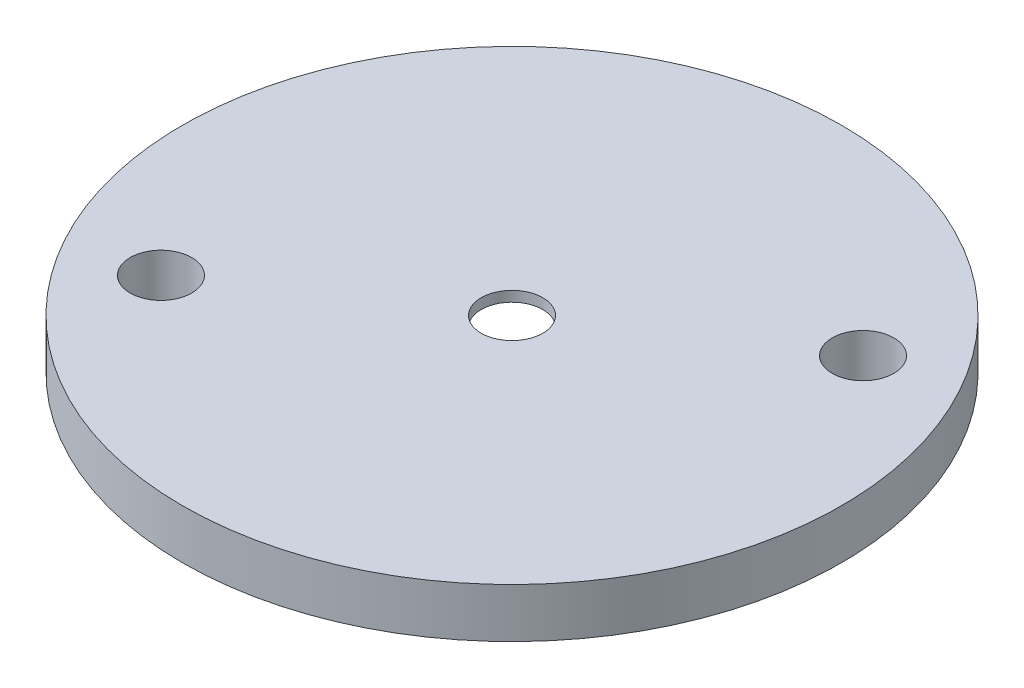
ISO-10303-21;
HEADER;
FILE_DESCRIPTION(('STEP AP214'),'2;1');
FILE_NAME('part.step','',(''),(''),'','','');
FILE_SCHEMA(('AUTOMOTIVE_DESIGN { 1 0 10303 214 1 1 1 1 }'));
ENDSEC;
DATA;
#1=APPLICATION_CONTEXT('core data for automotive mechanical design processes');
#2=APPLICATION_PROTOCOL_DEFINITION('international standard','automotive_design',2000,#1);
#3=PRODUCT_CONTEXT('',#1,'mechanical');
#4=PRODUCT('Part','Part','',(#3));
#5=PRODUCT_RELATED_PRODUCT_CATEGORY('part','',(#4));
#6=PRODUCT_DEFINITION_FORMATION('','',#4);
#7=PRODUCT_DEFINITION_CONTEXT('part definition',#1,'design');
#8=PRODUCT_DEFINITION('design','',#6,#7);
#9=PRODUCT_DEFINITION_SHAPE('','',#8);
#10=(LENGTH_UNIT() NAMED_UNIT(*) SI_UNIT(.MILLI.,.METRE.));
#11=(NAMED_UNIT(*) PLANE_ANGLE_UNIT() SI_UNIT($,.RADIAN.));
#12=(NAMED_UNIT(*) SI_UNIT($,.STERADIAN.) SOLID_ANGLE_UNIT());
#13=UNCERTAINTY_MEASURE_WITH_UNIT(LENGTH_MEASURE(1.E-05),#10,'distance_accuracy_value','');
#14=(GEOMETRIC_REPRESENTATION_CONTEXT(3) GLOBAL_UNCERTAINTY_ASSIGNED_CONTEXT((#13)) GLOBAL_UNIT_ASSIGNED_CONTEXT((#10,
#11,#12)) REPRESENTATION_CONTEXT('',''));
#15=CARTESIAN_POINT('',(0.,0.,0.));
#16=DIRECTION('',(0.,0.,1.));
#17=DIRECTION('',(1.,0.,0.));
#18=AXIS2_PLACEMENT_3D('',#15,#16,#17);
#19=CARTESIAN_POINT('',(0.,3.048,0.));
#20=DIRECTION('',(0.,-1.,0.));
#21=DIRECTION('',(0.,0.,-1.));
#22=AXIS2_PLACEMENT_3D('',#19,#20,#21);
#23=CYLINDRICAL_SURFACE('',#22,20.32);
#24=CARTESIAN_POINT('',(0.,3.048,0.));
#25=DIRECTION('',(0.,1.,0.));
#26=DIRECTION('',(0.,0.,1.));
#27=AXIS2_PLACEMENT_3D('',#24,#25,#26);
#28=CIRCLE('',#27,20.32);
#29=CARTESIAN_POINT('',(0.,3.048,-20.32));
#30=VERTEX_POINT('',#29);
#31=EDGE_CURVE('E12',#30,#30,#28,.T.);
#32=CARTESIAN_POINT('',(0.,0.,0.));
#33=DIRECTION('',(0.,1.,0.));
#34=DIRECTION('',(0.,0.,1.));
#35=AXIS2_PLACEMENT_3D('',#32,#33,#34);
#36=CIRCLE('',#35,20.32);
#37=CARTESIAN_POINT('',(0.,0.,-20.32));
#38=VERTEX_POINT('',#37);
#39=EDGE_CURVE('E44',#38,#38,#36,.T.);
#40=CARTESIAN_POINT('',(0.,3.048,-20.32));
#41=CARTESIAN_POINT('',(0.,3.01625,-20.32));
#42=CARTESIAN_POINT('',(0.,2.9845,-20.32));
#43=CARTESIAN_POINT('',(0.,2.921,-20.32));
#44=CARTESIAN_POINT('',(0.,2.88925,-20.32));
#45=CARTESIAN_POINT('',(0.,2.82575,-20.32));
#46=CARTESIAN_POINT('',(0.,2.794,-20.32));
#47=CARTESIAN_POINT('',(0.,2.7305,-20.32));
#48=CARTESIAN_POINT('',(0.,2.69875,-20.32));
#49=CARTESIAN_POINT('',(0.,2.63525,-20.32));
#50=CARTESIAN_POINT('',(0.,2.6035,-20.32));
#51=CARTESIAN_POINT('',(0.,2.54,-20.32));
#52=CARTESIAN_POINT('',(0.,2.50825,-20.32));
#53=CARTESIAN_POINT('',(0.,2.44475,-20.32));
#54=CARTESIAN_POINT('',(0.,2.413,-20.32));
#55=CARTESIAN_POINT('',(0.,2.3495,-20.32));
#56=CARTESIAN_POINT('',(0.,2.31775,-20.32));
#57=CARTESIAN_POINT('',(0.,2.25425,-20.32));
#58=CARTESIAN_POINT('',(0.,2.2225,-20.32));
#59=CARTESIAN_POINT('',(0.,2.159,-20.32));
#60=CARTESIAN_POINT('',(0.,2.12725,-20.32));
#61=CARTESIAN_POINT('',(0.,2.06375,-20.32));
#62=CARTESIAN_POINT('',(0.,2.032,-20.32));
#63=CARTESIAN_POINT('',(0.,1.9685,-20.32));
#64=CARTESIAN_POINT('',(0.,1.93675,-20.32));
#65=CARTESIAN_POINT('',(0.,1.87325,-20.32));
#66=CARTESIAN_POINT('',(0.,1.8415,-20.32));
#67=CARTESIAN_POINT('',(0.,1.778,-20.32));
#68=CARTESIAN_POINT('',(0.,1.74625,-20.32));
#69=CARTESIAN_POINT('',(0.,1.68275,-20.32));
#70=CARTESIAN_POINT('',(0.,1.651,-20.32));
#71=CARTESIAN_POINT('',(0.,1.5875,-20.32));
#72=CARTESIAN_POINT('',(0.,1.55575,-20.32));
#73=CARTESIAN_POINT('',(0.,1.49225,-20.32));
#74=CARTESIAN_POINT('',(0.,1.4605,-20.32));
#75=CARTESIAN_POINT('',(0.,1.397,-20.32));
#76=CARTESIAN_POINT('',(0.,1.36525,-20.32));
#77=CARTESIAN_POINT('',(0.,1.30175,-20.32));
#78=CARTESIAN_POINT('',(0.,1.27,-20.32));
#79=CARTESIAN_POINT('',(0.,1.2065,-20.32));
#80=CARTESIAN_POINT('',(0.,1.17475,-20.32));
#81=CARTESIAN_POINT('',(0.,1.11125,-20.32));
#82=CARTESIAN_POINT('',(0.,1.0795,-20.32));
#83=CARTESIAN_POINT('',(0.,1.016,-20.32));
#84=CARTESIAN_POINT('',(0.,0.98425,-20.32));
#85=CARTESIAN_POINT('',(0.,0.92075,-20.32));
#86=CARTESIAN_POINT('',(0.,0.889,-20.32));
#87=CARTESIAN_POINT('',(0.,0.8255,-20.32));
#88=CARTESIAN_POINT('',(0.,0.79375,-20.32));
#89=CARTESIAN_POINT('',(0.,0.73025,-20.32));
#90=CARTESIAN_POINT('',(0.,0.6985,-20.32));
#91=CARTESIAN_POINT('',(0.,0.635,-20.32));
#92=CARTESIAN_POINT('',(0.,0.60325,-20.32));
#93=CARTESIAN_POINT('',(0.,0.53975,-20.32));
#94=CARTESIAN_POINT('',(0.,0.508,-20.32));
#95=CARTESIAN_POINT('',(0.,0.4445,-20.32));
#96=CARTESIAN_POINT('',(0.,0.41275,-20.32));
#97=CARTESIAN_POINT('',(0.,0.34925,-20.32));
#98=CARTESIAN_POINT('',(0.,0.3175,-20.32));
#99=CARTESIAN_POINT('',(0.,0.254,-20.32));
#100=CARTESIAN_POINT('',(0.,0.22225,-20.32));
#101=CARTESIAN_POINT('',(0.,0.15875,-20.32));
#102=CARTESIAN_POINT('',(0.,0.127,-20.32));
#103=CARTESIAN_POINT('',(0.,0.0634999999999999,-20.32));
#104=CARTESIAN_POINT('',(0.,0.03175,-20.32));
#105=CARTESIAN_POINT('',(0.,0.,-20.32));
#106=B_SPLINE_CURVE_WITH_KNOTS('',3,(#40,#41,#42,#43,#44,#45,#46,#47,#48,#49,#50,#51,#52,#53,
#54,#55,#56,#57,#58,#59,#60,#61,#62,#63,#64,#65,#66,#67,#68,#69,#70,#71,#72,#73,#74,#75,#76,#77,
#78,#79,#80,#81,#82,#83,#84,#85,#86,#87,#88,#89,#90,#91,#92,#93,#94,#95,#96,#97,#98,#99,#100,
#101,#102,#103,#104,#105),.UNSPECIFIED.,.F.,.F.,(4,2,2,2,2,2,2,2,2,2,2,2,2,2,2,2,2,2,2,2,2,2,2,
2,2,2,2,2,2,2,2,2,4),(0.,0.0952499999999998,0.1905,0.28575,0.381,0.47625,0.5715,0.66675,0.762,
0.85725,0.9525,1.04775,1.143,1.23825,1.3335,1.42875,1.524,1.61925,1.7145,1.80975,1.905,2.00025,
2.0955,2.19075,2.286,2.38125,2.4765,2.57175,2.667,2.76225,2.8575,2.95275,3.048),.UNSPECIFIED.);
#107=EDGE_CURVE('BSEAM34',#30,#38,#106,.T.);
#108=ORIENTED_EDGE('',*,*,#31,.F.);
#109=ORIENTED_EDGE('',*,*,#39,.T.);
#110=ORIENTED_EDGE('',*,*,#107,.T.);
#111=ORIENTED_EDGE('',*,*,#107,.F.);
#112=EDGE_LOOP('',(#108,#110,#109,#111));
#113=FACE_BOUND('',#112,.T.);
#114=ADVANCED_FACE('F34',(#113),#23,.T.);
#115=CARTESIAN_POINT('',(0.,3.048,0.));
#116=DIRECTION('',(0.,1.,0.));
#117=DIRECTION('',(0.,0.,1.));
#118=AXIS2_PLACEMENT_3D('',#115,#116,#117);
#119=PLANE('',#118);
#120=CARTESIAN_POINT('',(12.9669844794509,3.048,-8.67821779565681));
#121=DIRECTION('',(0.,-1.,0.));
#122=DIRECTION('',(0.,0.,-1.));
#123=AXIS2_PLACEMENT_3D('',#120,#121,#122);
#124=CIRCLE('',#123,1.89864999999999);
#125=CARTESIAN_POINT('',(12.9669844794509,3.048,-10.5768677956568));
#126=VERTEX_POINT('',#125);
#127=EDGE_CURVE('E441',#126,#126,#124,.T.);
#128=ORIENTED_EDGE('',*,*,#127,.T.);
#129=EDGE_LOOP('',(#128));
#130=FACE_BOUND('',#129,.T.);
#131=CARTESIAN_POINT('',(-12.9669844794509,3.048,8.67821779565681));
#132=DIRECTION('',(0.,-1.,0.));
#133=DIRECTION('',(0.,0.,-1.));
#134=AXIS2_PLACEMENT_3D('',#131,#132,#133);
#135=CIRCLE('',#134,1.89864999999999);
#136=CARTESIAN_POINT('',(-12.9669844794509,3.048,6.77956779565682));
#137=VERTEX_POINT('',#136);
#138=EDGE_CURVE('E440',#137,#137,#135,.T.);
#139=ORIENTED_EDGE('',*,*,#138,.T.);
#140=EDGE_LOOP('',(#139));
#141=FACE_BOUND('',#140,.T.);
#142=CARTESIAN_POINT('',(0.,3.048,0.));
#143=DIRECTION('',(0.,1.,0.));
#144=DIRECTION('',(0.,0.,1.));
#145=AXIS2_PLACEMENT_3D('',#142,#143,#144);
#146=CIRCLE('',#145,1.89864999999999);
#147=CARTESIAN_POINT('',(0.,3.048,1.89864999999999));
#148=VERTEX_POINT('',#147);
#149=EDGE_CURVE('E444',#148,#148,#146,.T.);
#150=ORIENTED_EDGE('',*,*,#149,.F.);
#151=EDGE_LOOP('',(#150));
#152=FACE_BOUND('',#151,.T.);
#153=ORIENTED_EDGE('',*,*,#31,.T.);
#154=EDGE_LOOP('',(#153));
#155=FACE_BOUND('',#154,.T.);
#156=ADVANCED_FACE('F269',(#130,#141,#152,#155),#119,.T.);
#157=CARTESIAN_POINT('',(0.,0.,0.));
#158=DIRECTION('',(0.,1.,0.));
#159=DIRECTION('',(0.,0.,1.));
#160=AXIS2_PLACEMENT_3D('',#157,#158,#159);
#161=PLANE('',#160);
#162=CARTESIAN_POINT('',(12.9669844794509,0.,-8.67821779565681));
#163=DIRECTION('',(0.,-1.,0.));
#164=DIRECTION('',(0.,0.,-1.));
#165=AXIS2_PLACEMENT_3D('',#162,#163,#164);
#166=CIRCLE('',#165,1.89864999999999);
#167=CARTESIAN_POINT('',(12.9669844794509,0.,-10.5768677956568));
#168=VERTEX_POINT('',#167);
#169=EDGE_CURVE('E435',#168,#168,#166,.T.);
#170=ORIENTED_EDGE('',*,*,#169,.F.);
#171=EDGE_LOOP('',(#170));
#172=FACE_BOUND('',#171,.T.);
#173=CARTESIAN_POINT('',(-12.9669844794509,0.,8.67821779565681));
#174=DIRECTION('',(0.,-1.,0.));
#175=DIRECTION('',(0.,0.,-1.));
#176=AXIS2_PLACEMENT_3D('',#173,#174,#175);
#177=CIRCLE('',#176,1.89864999999999);
#178=CARTESIAN_POINT('',(-12.9669844794509,0.,6.77956779565682));
#179=VERTEX_POINT('',#178);
#180=EDGE_CURVE('E438',#179,#179,#177,.T.);
#181=ORIENTED_EDGE('',*,*,#180,.F.);
#182=EDGE_LOOP('',(#181));
#183=FACE_BOUND('',#182,.T.);
#184=DIRECTION('',(-0.943216166628687,0.,-0.332179564407993));
#185=VECTOR('',#184,1.);
#186=CARTESIAN_POINT('',(13.5557943309234,0.,-0.159737341594472));
#187=LINE('',#186,#185);
#188=CARTESIAN_POINT('',(13.5557943309234,0.,-0.159737341594471));
#189=VERTEX_POINT('',#188);
#190=CARTESIAN_POINT('',(4.83025957281303,0.,-3.23267484810027));
#191=VERTEX_POINT('',#190);
#192=EDGE_CURVE('E167',#189,#191,#187,.T.);
#193=ORIENTED_EDGE('',*,*,#192,.T.);
#194=DIRECTION('',(0.0525740363781355,0.,-0.998617029045124));
#195=VECTOR('',#194,1.);
#196=CARTESIAN_POINT('',(4.61388300106093,0.,0.877287865889007));
#197=LINE('',#196,#195);
#198=CARTESIAN_POINT('',(5.31661317660169,0.,-12.4707137041542));
#199=VERTEX_POINT('',#198);
#200=EDGE_CURVE('E172',#191,#199,#197,.T.);
#201=ORIENTED_EDGE('',*,*,#200,.T.);
#202=CARTESIAN_POINT('',(2.50031726783063,0.,-12.618982799566));
#203=DIRECTION('',(0.,1.,0.));
#204=DIRECTION('',(0.,0.,1.));
#205=AXIS2_PLACEMENT_3D('',#202,#203,#204);
#206=CIRCLE('',#205,2.82019615814483);
#207=CARTESIAN_POINT('',(-0.159737341595693,0.,-13.5557943309237));
#208=VERTEX_POINT('',#207);
#209=EDGE_CURVE('E175',#199,#208,#206,.T.);
#210=ORIENTED_EDGE('',*,*,#209,.T.);
#211=DIRECTION('',(-0.33217956440799,0.,0.943216166628689));
#212=VECTOR('',#211,1.);
#213=CARTESIAN_POINT('',(-0.159737341595695,0.,-13.5557943309237));
#214=LINE('',#213,#212);
#215=CARTESIAN_POINT('',(-3.23267484810145,0.,-4.83025957281329));
#216=VERTEX_POINT('',#215);
#217=EDGE_CURVE('E176',#208,#216,#214,.T.);
#218=ORIENTED_EDGE('',*,*,#217,.T.);
#219=DIRECTION('',(-0.998617029045124,0.,-0.0525740363781394));
#220=VECTOR('',#219,1.);
#221=CARTESIAN_POINT('',(0.877287865887849,0.,-4.61388300106117));
#222=LINE('',#221,#220);
#223=CARTESIAN_POINT('',(-12.4707137041554,0.,-5.31661317660197));
#224=VERTEX_POINT('',#223);
#225=EDGE_CURVE('E183',#216,#224,#222,.T.);
#226=ORIENTED_EDGE('',*,*,#225,.T.);
#227=CARTESIAN_POINT('',(-12.6189827995672,0.,-2.5003172678309));
#228=DIRECTION('',(0.,1.,0.));
#229=DIRECTION('',(0.,0.,1.));
#230=AXIS2_PLACEMENT_3D('',#227,#228,#229);
#231=CIRCLE('',#230,2.82019615814483);
#232=CARTESIAN_POINT('',(-13.5557943309248,0.,0.159737341595413));
#233=VERTEX_POINT('',#232);
#234=EDGE_CURVE('E186',#224,#233,#231,.T.);
#235=ORIENTED_EDGE('',*,*,#234,.T.);
#236=DIRECTION('',(0.943216166628687,0.,0.332179564407993));
#237=VECTOR('',#236,1.);
#238=CARTESIAN_POINT('',(-13.5557943309248,0.,0.159737341595417));
#239=LINE('',#238,#237);
#240=CARTESIAN_POINT('',(-4.83025957281442,0.,3.23267484810123));
#241=VERTEX_POINT('',#240);
#242=EDGE_CURVE('E187',#233,#241,#239,.T.);
#243=ORIENTED_EDGE('',*,*,#242,.T.);
#244=DIRECTION('',(-0.0525740363781285,0.,0.998617029045125));
#245=VECTOR('',#244,1.);
#246=CARTESIAN_POINT('',(-4.61388300106235,0.,-0.877287865888032));
#247=LINE('',#246,#245);
#248=CARTESIAN_POINT('',(-5.31661317660301,0.,12.4707137041552));
#249=VERTEX_POINT('',#248);
#250=EDGE_CURVE('E156',#241,#249,#247,.T.);
#251=ORIENTED_EDGE('',*,*,#250,.T.);
#252=CARTESIAN_POINT('',(-2.50031726783195,0.,12.618982799567));
#253=DIRECTION('',(0.,1.,0.));
#254=DIRECTION('',(0.,0.,1.));
#255=AXIS2_PLACEMENT_3D('',#252,#253,#254);
#256=CIRCLE('',#255,2.82019615814483);
#257=CARTESIAN_POINT('',(0.159737341594376,0.,13.5557943309246));
#258=VERTEX_POINT('',#257);
#259=EDGE_CURVE('E150',#249,#258,#256,.T.);
#260=ORIENTED_EDGE('',*,*,#259,.T.);
#261=DIRECTION('',(0.332179564407983,0.,-0.943216166628691));
#262=VECTOR('',#261,1.);
#263=CARTESIAN_POINT('',(0.159737341594376,0.,13.5557943309246));
#264=LINE('',#263,#262);
#265=CARTESIAN_POINT('',(3.23267484810006,0.,4.83025957281423));
#266=VERTEX_POINT('',#265);
#267=EDGE_CURVE('E53',#258,#266,#264,.T.);
#268=ORIENTED_EDGE('',*,*,#267,.T.);
#269=DIRECTION('',(0.998617029045124,0.,0.0525740363781394));
#270=VECTOR('',#269,1.);
#271=CARTESIAN_POINT('',(-0.877287865889259,0.,4.61388300106211));
#272=LINE('',#271,#270);
#273=CARTESIAN_POINT('',(12.470713704154,0.,5.31661317660291));
#274=VERTEX_POINT('',#273);
#275=EDGE_CURVE('E143',#266,#274,#272,.T.);
#276=ORIENTED_EDGE('',*,*,#275,.T.);
#277=CARTESIAN_POINT('',(12.6189827995658,0.,2.50031726783185));
#278=DIRECTION('',(0.,1.,0.));
#279=DIRECTION('',(0.,0.,1.));
#280=AXIS2_PLACEMENT_3D('',#277,#278,#279);
#281=CIRCLE('',#280,2.82019615814483);
#282=EDGE_CURVE('E166',#274,#189,#281,.T.);
#283=ORIENTED_EDGE('',*,*,#282,.T.);
#284=EDGE_LOOP('',(#193,#201,#210,#218,#226,#235,#243,#251,#260,#268,#276,#283));
#285=FACE_BOUND('',#284,.T.);
#286=ORIENTED_EDGE('',*,*,#39,.F.);
#287=EDGE_LOOP('',(#286));
#288=FACE_BOUND('',#287,.T.);
#289=ADVANCED_FACE('F194',(#172,#183,#285,#288),#161,.F.);
#290=CARTESIAN_POINT('',(13.5557943309234,2.15899999999999,-0.159737341594473));
#291=DIRECTION('',(-0.332179564407993,0.,0.943216166628688));
#292=DIRECTION('',(0.943216166628688,0.,0.332179564407993));
#293=AXIS2_PLACEMENT_3D('',#290,#291,#292);
#294=PLANE('',#293);
#295=DIRECTION('',(0.,-1.,0.));
#296=VECTOR('',#295,1.);
#297=CARTESIAN_POINT('',(4.83025957281304,2.159,-3.23267484810027));
#298=LINE('',#297,#296);
#299=CARTESIAN_POINT('',(4.83025957281304,2.413,-3.23267484810027));
#300=VERTEX_POINT('',#299);
#301=EDGE_CURVE('E144',#300,#191,#298,.T.);
#302=ORIENTED_EDGE('',*,*,#301,.T.);
#303=ORIENTED_EDGE('',*,*,#192,.F.);
#304=DIRECTION('',(0.,-1.,0.));
#305=VECTOR('',#304,1.);
#306=CARTESIAN_POINT('',(13.5557943309234,2.15899999999999,-0.159737341594471));
#307=LINE('',#306,#305);
#308=CARTESIAN_POINT('',(13.5557943309234,2.41299999999999,-0.159737341594471));
#309=VERTEX_POINT('',#308);
#310=EDGE_CURVE('E162',#309,#189,#307,.T.);
#311=ORIENTED_EDGE('',*,*,#310,.F.);
#312=DIRECTION('',(-0.943216166628687,0.,-0.332179564407993));
#313=VECTOR('',#312,1.);
#314=CARTESIAN_POINT('',(13.5557943309234,2.41299999999999,-0.159737341594473));
#315=LINE('',#314,#313);
#316=EDGE_CURVE('E137',#309,#300,#315,.T.);
#317=ORIENTED_EDGE('',*,*,#316,.T.);
#318=EDGE_LOOP('',(#302,#303,#311,#317));
#319=FACE_BOUND('',#318,.T.);
#320=ADVANCED_FACE('F36',(#319),#294,.T.);
#321=CARTESIAN_POINT('',(-0.877287865889259,2.159,4.61388300106211));
#322=DIRECTION('',(0.0525740363781394,0.,-0.998617029045124));
#323=DIRECTION('',(-0.998617029045124,0.,-0.052574036378139));
#324=AXIS2_PLACEMENT_3D('',#321,#322,#323);
#325=PLANE('',#324);
#326=DIRECTION('',(0.,1.,0.));
#327=VECTOR('',#326,1.);
#328=CARTESIAN_POINT('',(3.23267484810006,2.159,4.83025957281423));
#329=LINE('',#328,#327);
#330=CARTESIAN_POINT('',(3.23267484810006,2.413,4.83025957281423));
#331=VERTEX_POINT('',#330);
#332=EDGE_CURVE('E140',#266,#331,#329,.T.);
#333=ORIENTED_EDGE('',*,*,#332,.T.);
#334=DIRECTION('',(0.998617029045124,0.,0.0525740363781394));
#335=VECTOR('',#334,1.);
#336=CARTESIAN_POINT('',(-0.877287865889259,2.413,4.61388300106211));
#337=LINE('',#336,#335);
#338=CARTESIAN_POINT('',(12.470713704154,2.41299999999999,5.31661317660291));
#339=VERTEX_POINT('',#338);
#340=EDGE_CURVE('E127',#331,#339,#337,.T.);
#341=ORIENTED_EDGE('',*,*,#340,.T.);
#342=DIRECTION('',(0.,1.,0.));
#343=VECTOR('',#342,1.);
#344=CARTESIAN_POINT('',(12.470713704154,2.15899999999999,5.31661317660291));
#345=LINE('',#344,#343);
#346=EDGE_CURVE('E160',#339,#274,#345,.F.);
#347=ORIENTED_EDGE('',*,*,#346,.T.);
#348=ORIENTED_EDGE('',*,*,#275,.F.);
#349=EDGE_LOOP('',(#333,#341,#347,#348));
#350=FACE_BOUND('',#349,.T.);
#351=ADVANCED_FACE('F141',(#350),#325,.T.);
#352=CARTESIAN_POINT('',(12.6189827995658,2.15899999999999,2.50031726783185));
#353=DIRECTION('',(0.,-1.,0.));
#354=DIRECTION('',(0.556188434446726,0.,0.831056210726868));
#355=AXIS2_PLACEMENT_3D('',#352,#353,#354);
#356=CYLINDRICAL_SURFACE('',#355,2.82019615814483);
#357=ORIENTED_EDGE('',*,*,#282,.F.);
#358=ORIENTED_EDGE('',*,*,#346,.F.);
#359=CARTESIAN_POINT('',(12.6189827995658,2.41299999999999,2.50031726783185));
#360=DIRECTION('',(0.,1.,0.));
#361=DIRECTION('',(-1.,0.,0.));
#362=AXIS2_PLACEMENT_3D('',#359,#360,#361);
#363=CIRCLE('',#362,2.82019615814483);
#364=EDGE_CURVE('E134',#339,#309,#363,.T.);
#365=ORIENTED_EDGE('',*,*,#364,.T.);
#366=ORIENTED_EDGE('',*,*,#310,.T.);
#367=EDGE_LOOP('',(#357,#358,#365,#366));
#368=FACE_BOUND('',#367,.T.);
#369=ADVANCED_FACE('F235',(#368),#356,.F.);
#370=CARTESIAN_POINT('',(12.6189827995658,2.41299999999999,2.50031726783185));
#371=DIRECTION('',(0.,1.,0.));
#372=DIRECTION('',(-0.556188434446726,0.,-0.831056210726868));
#373=AXIS2_PLACEMENT_3D('',#370,#371,#372);
#374=PLANE('',#373);
#375=CARTESIAN_POINT('',(0.,2.413,0.));
#376=DIRECTION('',(0.,1.,0.));
#377=DIRECTION('',(-1.,0.,0.));
#378=AXIS2_PLACEMENT_3D('',#375,#376,#377);
#379=CIRCLE('',#378,1.89864999999999);
#380=CARTESIAN_POINT('',(-1.89864999999999,2.413,0.));
#381=VERTEX_POINT('',#380);
#382=EDGE_CURVE('E38',#381,#381,#379,.T.);
#383=ORIENTED_EDGE('',*,*,#382,.T.);
#384=EDGE_LOOP('',(#383));
#385=FACE_BOUND('',#384,.T.);
#386=ORIENTED_EDGE('',*,*,#316,.F.);
#387=ORIENTED_EDGE('',*,*,#364,.F.);
#388=ORIENTED_EDGE('',*,*,#340,.F.);
#389=DIRECTION('',(0.332179564407983,0.,-0.943216166628691));
#390=VECTOR('',#389,1.);
#391=CARTESIAN_POINT('',(0.159737341594378,2.413,13.5557943309246));
#392=LINE('',#391,#390);
#393=CARTESIAN_POINT('',(0.159737341594375,2.413,13.5557943309246));
#394=VERTEX_POINT('',#393);
#395=EDGE_CURVE('E133',#394,#331,#392,.T.);
#396=ORIENTED_EDGE('',*,*,#395,.F.);
#397=CARTESIAN_POINT('',(-2.50031726783195,2.413,12.618982799567));
#398=DIRECTION('',(0.,1.,0.));
#399=DIRECTION('',(-1.,0.,0.));
#400=AXIS2_PLACEMENT_3D('',#397,#398,#399);
#401=CIRCLE('',#400,2.82019615814483);
#402=CARTESIAN_POINT('',(-5.31661317660301,2.413,12.4707137041552));
#403=VERTEX_POINT('',#402);
#404=EDGE_CURVE('E153',#403,#394,#401,.T.);
#405=ORIENTED_EDGE('',*,*,#404,.F.);
#406=DIRECTION('',(-0.0525740363781285,0.,0.998617029045125));
#407=VECTOR('',#406,1.);
#408=CARTESIAN_POINT('',(-4.61388300106235,2.413,-0.877287865888031));
#409=LINE('',#408,#407);
#410=CARTESIAN_POINT('',(-4.83025957281442,2.413,3.23267484810123));
#411=VERTEX_POINT('',#410);
#412=EDGE_CURVE('E149',#411,#403,#409,.T.);
#413=ORIENTED_EDGE('',*,*,#412,.F.);
#414=DIRECTION('',(0.943216166628687,0.,0.332179564407993));
#415=VECTOR('',#414,1.);
#416=CARTESIAN_POINT('',(-13.5557943309248,2.41300000000001,0.159737341595416));
#417=LINE('',#416,#415);
#418=CARTESIAN_POINT('',(-13.5557943309248,2.41300000000001,0.159737341595413));
#419=VERTEX_POINT('',#418);
#420=EDGE_CURVE('E190',#419,#411,#417,.T.);
#421=ORIENTED_EDGE('',*,*,#420,.F.);
#422=CARTESIAN_POINT('',(-12.6189827995672,2.41300000000001,-2.5003172678309));
#423=DIRECTION('',(0.,1.,0.));
#424=DIRECTION('',(-1.,0.,0.));
#425=AXIS2_PLACEMENT_3D('',#422,#423,#424);
#426=CIRCLE('',#425,2.82019615814483);
#427=CARTESIAN_POINT('',(-12.4707137041554,2.41300000000001,-5.31661317660197));
#428=VERTEX_POINT('',#427);
#429=EDGE_CURVE('E106',#428,#419,#426,.T.);
#430=ORIENTED_EDGE('',*,*,#429,.F.);
#431=DIRECTION('',(-0.998617029045124,0.,-0.0525740363781394));
#432=VECTOR('',#431,1.);
#433=CARTESIAN_POINT('',(0.877287865887849,2.413,-4.61388300106117));
#434=LINE('',#433,#432);
#435=CARTESIAN_POINT('',(-3.23267484810145,2.413,-4.83025957281329));
#436=VERTEX_POINT('',#435);
#437=EDGE_CURVE('E216',#436,#428,#434,.T.);
#438=ORIENTED_EDGE('',*,*,#437,.F.);
#439=DIRECTION('',(-0.33217956440799,0.,0.943216166628689));
#440=VECTOR('',#439,1.);
#441=CARTESIAN_POINT('',(-0.159737341595693,2.413,-13.5557943309237));
#442=LINE('',#441,#440);
#443=CARTESIAN_POINT('',(-0.159737341595691,2.413,-13.5557943309237));
#444=VERTEX_POINT('',#443);
#445=EDGE_CURVE('E179',#444,#436,#442,.T.);
#446=ORIENTED_EDGE('',*,*,#445,.F.);
#447=CARTESIAN_POINT('',(2.50031726783063,2.413,-12.618982799566));
#448=DIRECTION('',(0.,1.,0.));
#449=DIRECTION('',(-1.,0.,0.));
#450=AXIS2_PLACEMENT_3D('',#447,#448,#449);
#451=CIRCLE('',#450,2.82019615814483);
#452=CARTESIAN_POINT('',(5.31661317660169,2.413,-12.4707137041542));
#453=VERTEX_POINT('',#452);
#454=EDGE_CURVE('E223',#453,#444,#451,.T.);
#455=ORIENTED_EDGE('',*,*,#454,.F.);
#456=DIRECTION('',(0.0525740363781355,0.,-0.998617029045124));
#457=VECTOR('',#456,1.);
#458=CARTESIAN_POINT('',(4.61388300106093,2.413,0.877287865889007));
#459=LINE('',#458,#457);
#460=EDGE_CURVE('E226',#300,#453,#459,.T.);
#461=ORIENTED_EDGE('',*,*,#460,.F.);
#462=EDGE_LOOP('',(#386,#387,#388,#396,#405,#413,#421,#430,#438,#446,#455,#461));
#463=FACE_BOUND('',#462,.T.);
#464=ADVANCED_FACE('F130',(#385,#463),#374,.F.);
#465=CARTESIAN_POINT('',(4.61388300106093,2.159,0.877287865889007));
#466=DIRECTION('',(-0.998617029045124,0.,-0.0525740363781355));
#467=DIRECTION('',(-0.0525740363781359,0.,0.998617029045124));
#468=AXIS2_PLACEMENT_3D('',#465,#466,#467);
#469=PLANE('',#468);
#470=ORIENTED_EDGE('',*,*,#460,.T.);
#471=DIRECTION('',(0.,1.,0.));
#472=VECTOR('',#471,1.);
#473=CARTESIAN_POINT('',(5.31661317660169,2.159,-12.4707137041542));
#474=LINE('',#473,#472);
#475=EDGE_CURVE('E145',#453,#199,#474,.F.);
#476=ORIENTED_EDGE('',*,*,#475,.T.);
#477=ORIENTED_EDGE('',*,*,#200,.F.);
#478=ORIENTED_EDGE('',*,*,#301,.F.);
#479=EDGE_LOOP('',(#470,#476,#477,#478));
#480=FACE_BOUND('',#479,.T.);
#481=ADVANCED_FACE('F243',(#480),#469,.T.);
#482=CARTESIAN_POINT('',(0.159737341594377,2.159,13.5557943309246));
#483=DIRECTION('',(-0.943216166628691,0.,-0.332179564407983));
#484=DIRECTION('',(-0.332179564407983,0.,0.943216166628691));
#485=AXIS2_PLACEMENT_3D('',#482,#483,#484);
#486=PLANE('',#485);
#487=ORIENTED_EDGE('',*,*,#267,.F.);
#488=DIRECTION('',(0.,-1.,0.));
#489=VECTOR('',#488,1.);
#490=CARTESIAN_POINT('',(0.159737341594375,2.159,13.5557943309246));
#491=LINE('',#490,#489);
#492=EDGE_CURVE('E148',#394,#258,#491,.T.);
#493=ORIENTED_EDGE('',*,*,#492,.F.);
#494=ORIENTED_EDGE('',*,*,#395,.T.);
#495=ORIENTED_EDGE('',*,*,#332,.F.);
#496=EDGE_LOOP('',(#487,#493,#494,#495));
#497=FACE_BOUND('',#496,.T.);
#498=ADVANCED_FACE('F147',(#497),#486,.T.);
#499=CARTESIAN_POINT('',(-0.159737341595693,2.159,-13.5557943309237));
#500=DIRECTION('',(0.943216166628689,0.,0.33217956440799));
#501=DIRECTION('',(0.33217956440799,0.,-0.943216166628689));
#502=AXIS2_PLACEMENT_3D('',#499,#500,#501);
#503=PLANE('',#502);
#504=DIRECTION('',(0.,-1.,0.));
#505=VECTOR('',#504,1.);
#506=CARTESIAN_POINT('',(-3.23267484810145,2.159,-4.83025957281328));
#507=LINE('',#506,#505);
#508=EDGE_CURVE('E182',#436,#216,#507,.T.);
#509=ORIENTED_EDGE('',*,*,#508,.T.);
#510=ORIENTED_EDGE('',*,*,#217,.F.);
#511=DIRECTION('',(0.,-1.,0.));
#512=VECTOR('',#511,1.);
#513=CARTESIAN_POINT('',(-0.159737341595691,2.159,-13.5557943309237));
#514=LINE('',#513,#512);
#515=EDGE_CURVE('E221',#444,#208,#514,.T.);
#516=ORIENTED_EDGE('',*,*,#515,.F.);
#517=ORIENTED_EDGE('',*,*,#445,.T.);
#518=EDGE_LOOP('',(#509,#510,#516,#517));
#519=FACE_BOUND('',#518,.T.);
#520=ADVANCED_FACE('F252',(#519),#503,.T.);
#521=CARTESIAN_POINT('',(2.50031726783063,2.159,-12.618982799566));
#522=DIRECTION('',(0.,-1.,0.));
#523=DIRECTION('',(0.556188434446726,0.,0.831056210726868));
#524=AXIS2_PLACEMENT_3D('',#521,#522,#523);
#525=CYLINDRICAL_SURFACE('',#524,2.82019615814483);
#526=ORIENTED_EDGE('',*,*,#209,.F.);
#527=ORIENTED_EDGE('',*,*,#475,.F.);
#528=ORIENTED_EDGE('',*,*,#454,.T.);
#529=ORIENTED_EDGE('',*,*,#515,.T.);
#530=EDGE_LOOP('',(#526,#527,#528,#529));
#531=FACE_BOUND('',#530,.T.);
#532=ADVANCED_FACE('F247',(#531),#525,.F.);
#533=CARTESIAN_POINT('',(0.877287865887849,2.159,-4.61388300106117));
#534=DIRECTION('',(-0.0525740363781394,0.,0.998617029045124));
#535=DIRECTION('',(0.998617029045124,0.,0.052574036378139));
#536=AXIS2_PLACEMENT_3D('',#533,#534,#535);
#537=PLANE('',#536);
#538=ORIENTED_EDGE('',*,*,#437,.T.);
#539=DIRECTION('',(0.,1.,0.));
#540=VECTOR('',#539,1.);
#541=CARTESIAN_POINT('',(-12.4707137041554,2.15900000000001,-5.31661317660197));
#542=LINE('',#541,#540);
#543=EDGE_CURVE('E214',#428,#224,#542,.F.);
#544=ORIENTED_EDGE('',*,*,#543,.T.);
#545=ORIENTED_EDGE('',*,*,#225,.F.);
#546=ORIENTED_EDGE('',*,*,#508,.F.);
#547=EDGE_LOOP('',(#538,#544,#545,#546));
#548=FACE_BOUND('',#547,.T.);
#549=ADVANCED_FACE('F255',(#548),#537,.T.);
#550=CARTESIAN_POINT('',(-13.5557943309248,2.15900000000001,0.159737341595416));
#551=DIRECTION('',(0.332179564407993,0.,-0.943216166628688));
#552=DIRECTION('',(-0.943216166628688,0.,-0.332179564407993));
#553=AXIS2_PLACEMENT_3D('',#550,#551,#552);
#554=PLANE('',#553);
#555=DIRECTION('',(0.,-1.,0.));
#556=VECTOR('',#555,1.);
#557=CARTESIAN_POINT('',(-4.83025957281442,2.159,3.23267484810123));
#558=LINE('',#557,#556);
#559=EDGE_CURVE('E98',#411,#241,#558,.T.);
#560=ORIENTED_EDGE('',*,*,#559,.T.);
#561=ORIENTED_EDGE('',*,*,#242,.F.);
#562=DIRECTION('',(0.,-1.,0.));
#563=VECTOR('',#562,1.);
#564=CARTESIAN_POINT('',(-13.5557943309248,2.15900000000001,0.159737341595413));
#565=LINE('',#564,#563);
#566=EDGE_CURVE('E212',#419,#233,#565,.T.);
#567=ORIENTED_EDGE('',*,*,#566,.F.);
#568=ORIENTED_EDGE('',*,*,#420,.T.);
#569=EDGE_LOOP('',(#560,#561,#567,#568));
#570=FACE_BOUND('',#569,.T.);
#571=ADVANCED_FACE('F259',(#570),#554,.T.);
#572=CARTESIAN_POINT('',(-12.6189827995672,2.15900000000001,-2.5003172678309));
#573=DIRECTION('',(0.,-1.,0.));
#574=DIRECTION('',(0.556188434446726,0.,0.831056210726868));
#575=AXIS2_PLACEMENT_3D('',#572,#573,#574);
#576=CYLINDRICAL_SURFACE('',#575,2.82019615814483);
#577=ORIENTED_EDGE('',*,*,#234,.F.);
#578=ORIENTED_EDGE('',*,*,#543,.F.);
#579=ORIENTED_EDGE('',*,*,#429,.T.);
#580=ORIENTED_EDGE('',*,*,#566,.T.);
#581=EDGE_LOOP('',(#577,#578,#579,#580));
#582=FACE_BOUND('',#581,.T.);
#583=ADVANCED_FACE('F257',(#582),#576,.F.);
#584=CARTESIAN_POINT('',(-4.61388300106235,2.159,-0.877287865888031));
#585=DIRECTION('',(0.998617029045125,0.,0.0525740363781285));
#586=DIRECTION('',(0.0525740363781289,0.,-0.998617029045125));
#587=AXIS2_PLACEMENT_3D('',#584,#585,#586);
#588=PLANE('',#587);
#589=ORIENTED_EDGE('',*,*,#412,.T.);
#590=DIRECTION('',(0.,1.,0.));
#591=VECTOR('',#590,1.);
#592=CARTESIAN_POINT('',(-5.31661317660301,2.159,12.4707137041552));
#593=LINE('',#592,#591);
#594=EDGE_CURVE('E202',#403,#249,#593,.F.);
#595=ORIENTED_EDGE('',*,*,#594,.T.);
#596=ORIENTED_EDGE('',*,*,#250,.F.);
#597=ORIENTED_EDGE('',*,*,#559,.F.);
#598=EDGE_LOOP('',(#589,#595,#596,#597));
#599=FACE_BOUND('',#598,.T.);
#600=ADVANCED_FACE('F200',(#599),#588,.T.);
#601=CARTESIAN_POINT('',(-2.50031726783195,2.159,12.618982799567));
#602=DIRECTION('',(0.,-1.,0.));
#603=DIRECTION('',(0.556188434446726,0.,0.831056210726868));
#604=AXIS2_PLACEMENT_3D('',#601,#602,#603);
#605=CYLINDRICAL_SURFACE('',#604,2.82019615814483);
#606=ORIENTED_EDGE('',*,*,#259,.F.);
#607=ORIENTED_EDGE('',*,*,#594,.F.);
#608=ORIENTED_EDGE('',*,*,#404,.T.);
#609=ORIENTED_EDGE('',*,*,#492,.T.);
#610=EDGE_LOOP('',(#606,#607,#608,#609));
#611=FACE_BOUND('',#610,.T.);
#612=ADVANCED_FACE('F207',(#611),#605,.F.);
#613=CARTESIAN_POINT('',(0.,3.048,0.));
#614=DIRECTION('',(0.,1.,0.));
#615=DIRECTION('',(0.,0.,1.));
#616=AXIS2_PLACEMENT_3D('',#613,#614,#615);
#617=CYLINDRICAL_SURFACE('',#616,1.89864999999999);
#618=ORIENTED_EDGE('',*,*,#149,.T.);
#619=EDGE_LOOP('',(#618));
#620=FACE_BOUND('',#619,.T.);
#621=ORIENTED_EDGE('',*,*,#382,.F.);
#622=EDGE_LOOP('',(#621));
#623=FACE_BOUND('',#622,.T.);
#624=ADVANCED_FACE('F283',(#620,#623),#617,.F.);
#625=CARTESIAN_POINT('',(-12.9669844794509,0.,8.67821779565681));
#626=DIRECTION('',(0.,-1.,0.));
#627=DIRECTION('',(0.,0.,-1.));
#628=AXIS2_PLACEMENT_3D('',#625,#626,#627);
#629=CYLINDRICAL_SURFACE('',#628,1.89864999999999);
#630=ORIENTED_EDGE('',*,*,#138,.F.);
#631=EDGE_LOOP('',(#630));
#632=FACE_BOUND('',#631,.T.);
#633=ORIENTED_EDGE('',*,*,#180,.T.);
#634=EDGE_LOOP('',(#633));
#635=FACE_BOUND('',#634,.T.);
#636=ADVANCED_FACE('F300',(#632,#635),#629,.F.);
#637=CARTESIAN_POINT('',(12.9669844794509,0.,-8.67821779565681));
#638=DIRECTION('',(0.,-1.,0.));
#639=DIRECTION('',(0.,0.,-1.));
#640=AXIS2_PLACEMENT_3D('',#637,#638,#639);
#641=CYLINDRICAL_SURFACE('',#640,1.89864999999999);
#642=ORIENTED_EDGE('',*,*,#127,.F.);
#643=EDGE_LOOP('',(#642));
#644=FACE_BOUND('',#643,.T.);
#645=ORIENTED_EDGE('',*,*,#169,.T.);
#646=EDGE_LOOP('',(#645));
#647=FACE_BOUND('',#646,.T.);
#648=ADVANCED_FACE('F309',(#644,#647),#641,.F.);
#649=CLOSED_SHELL('',(#114,#156,#289,#320,#351,#369,#464,#481,#498,#520,#532,#549,#571,#583,
#600,#612,#624,#636,#648));
#650=MANIFOLD_SOLID_BREP('B2',#649);
#651=ADVANCED_BREP_SHAPE_REPRESENTATION('',(#18,#650),#14);
#652=SHAPE_DEFINITION_REPRESENTATION(#9,#651);
ENDSEC;
END-ISO-10303-21;
